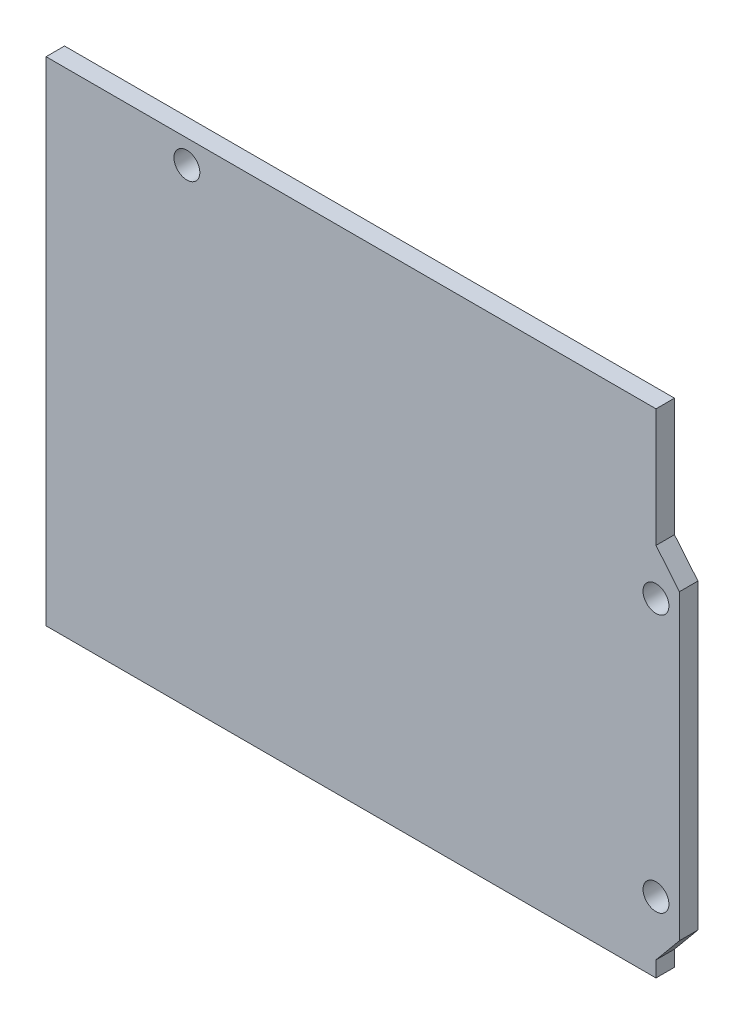
ISO-10303-21;
HEADER;
FILE_DESCRIPTION(('STEP AP214'),'2;1');
FILE_NAME('part.step','',(''),(''),'','','');
FILE_SCHEMA(('AUTOMOTIVE_DESIGN { 1 0 10303 214 1 1 1 1 }'));
ENDSEC;
DATA;
#1=APPLICATION_CONTEXT('core data for automotive mechanical design processes');
#2=APPLICATION_PROTOCOL_DEFINITION('international standard','automotive_design',2000,#1);
#3=PRODUCT_CONTEXT('',#1,'mechanical');
#4=PRODUCT('Part','Part','',(#3));
#5=PRODUCT_RELATED_PRODUCT_CATEGORY('part','',(#4));
#6=PRODUCT_DEFINITION_FORMATION('','',#4);
#7=PRODUCT_DEFINITION_CONTEXT('part definition',#1,'design');
#8=PRODUCT_DEFINITION('design','',#6,#7);
#9=PRODUCT_DEFINITION_SHAPE('','',#8);
#10=(LENGTH_UNIT() NAMED_UNIT(*) SI_UNIT(.MILLI.,.METRE.));
#11=(NAMED_UNIT(*) PLANE_ANGLE_UNIT() SI_UNIT($,.RADIAN.));
#12=(NAMED_UNIT(*) SI_UNIT($,.STERADIAN.) SOLID_ANGLE_UNIT());
#13=UNCERTAINTY_MEASURE_WITH_UNIT(LENGTH_MEASURE(1.E-05),#10,'distance_accuracy_value','');
#14=(GEOMETRIC_REPRESENTATION_CONTEXT(3) GLOBAL_UNCERTAINTY_ASSIGNED_CONTEXT((#13)) GLOBAL_UNIT_ASSIGNED_CONTEXT((#10,
#11,#12)) REPRESENTATION_CONTEXT('',''));
#15=CARTESIAN_POINT('',(0.,0.,0.));
#16=DIRECTION('',(0.,0.,1.));
#17=DIRECTION('',(1.,0.,0.));
#18=AXIS2_PLACEMENT_3D('',#15,#16,#17);
#19=CARTESIAN_POINT('',(0.,0.,-2.));
#20=DIRECTION('',(0.,-1.,0.));
#21=DIRECTION('',(0.,0.,-1.));
#22=AXIS2_PLACEMENT_3D('',#19,#20,#21);
#23=PLANE('',#22);
#24=DIRECTION('',(1.,0.,0.));
#25=VECTOR('',#24,1.);
#26=CARTESIAN_POINT('',(0.,0.,0.));
#27=LINE('',#26,#25);
#28=CARTESIAN_POINT('',(0.,0.,0.));
#29=VERTEX_POINT('',#28);
#30=CARTESIAN_POINT('',(66.0000000000001,0.,0.));
#31=VERTEX_POINT('',#30);
#32=EDGE_CURVE('E133',#29,#31,#27,.T.);
#33=ORIENTED_EDGE('',*,*,#32,.F.);
#34=DIRECTION('',(0.,0.,1.));
#35=VECTOR('',#34,1.);
#36=CARTESIAN_POINT('',(0.,0.,-2.));
#37=LINE('',#36,#35);
#38=CARTESIAN_POINT('',(0.,0.,-2.));
#39=VERTEX_POINT('',#38);
#40=EDGE_CURVE('E11',#39,#29,#37,.T.);
#41=ORIENTED_EDGE('',*,*,#40,.F.);
#42=DIRECTION('',(1.,0.,0.));
#43=VECTOR('',#42,1.);
#44=CARTESIAN_POINT('',(0.,0.,-2.));
#45=LINE('',#44,#43);
#46=CARTESIAN_POINT('',(66.0000000000001,0.,-2.));
#47=VERTEX_POINT('',#46);
#48=EDGE_CURVE('E154',#39,#47,#45,.T.);
#49=ORIENTED_EDGE('',*,*,#48,.T.);
#50=DIRECTION('',(0.,0.,1.));
#51=VECTOR('',#50,1.);
#52=CARTESIAN_POINT('',(66.0000000000001,0.,-2.));
#53=LINE('',#52,#51);
#54=EDGE_CURVE('E39',#47,#31,#53,.T.);
#55=ORIENTED_EDGE('',*,*,#54,.T.);
#56=EDGE_LOOP('',(#33,#41,#49,#55));
#57=FACE_BOUND('',#56,.T.);
#58=ADVANCED_FACE('F36',(#57),#23,.T.);
#59=CARTESIAN_POINT('',(0.,0.,-2.));
#60=DIRECTION('',(-1.,0.,0.));
#61=DIRECTION('',(0.,0.,1.));
#62=AXIS2_PLACEMENT_3D('',#59,#60,#61);
#63=PLANE('',#62);
#64=DIRECTION('',(0.,-1.,0.));
#65=VECTOR('',#64,1.);
#66=CARTESIAN_POINT('',(0.,0.,0.));
#67=LINE('',#66,#65);
#68=CARTESIAN_POINT('',(0.,53.34,0.));
#69=VERTEX_POINT('',#68);
#70=EDGE_CURVE('E152',#69,#29,#67,.T.);
#71=ORIENTED_EDGE('',*,*,#70,.F.);
#72=DIRECTION('',(0.,0.,1.));
#73=VECTOR('',#72,1.);
#74=CARTESIAN_POINT('',(0.,53.34,-2.));
#75=LINE('',#74,#73);
#76=CARTESIAN_POINT('',(0.,53.34,-2.));
#77=VERTEX_POINT('',#76);
#78=EDGE_CURVE('E45',#77,#69,#75,.T.);
#79=ORIENTED_EDGE('',*,*,#78,.F.);
#80=DIRECTION('',(0.,-1.,0.));
#81=VECTOR('',#80,1.);
#82=CARTESIAN_POINT('',(0.,0.,-2.));
#83=LINE('',#82,#81);
#84=EDGE_CURVE('E123',#77,#39,#83,.T.);
#85=ORIENTED_EDGE('',*,*,#84,.T.);
#86=ORIENTED_EDGE('',*,*,#40,.T.);
#87=EDGE_LOOP('',(#71,#79,#85,#86));
#88=FACE_BOUND('',#87,.T.);
#89=ADVANCED_FACE('F166',(#88),#63,.T.);
#90=CARTESIAN_POINT('',(0.,53.34,-2.));
#91=DIRECTION('',(0.,1.,0.));
#92=DIRECTION('',(0.,0.,1.));
#93=AXIS2_PLACEMENT_3D('',#90,#91,#92);
#94=PLANE('',#93);
#95=DIRECTION('',(-1.,0.,0.));
#96=VECTOR('',#95,1.);
#97=CARTESIAN_POINT('',(0.,53.34,0.));
#98=LINE('',#97,#96);
#99=CARTESIAN_POINT('',(66.,53.34,0.));
#100=VERTEX_POINT('',#99);
#101=EDGE_CURVE('E110',#100,#69,#98,.T.);
#102=ORIENTED_EDGE('',*,*,#101,.F.);
#103=DIRECTION('',(0.,0.,1.));
#104=VECTOR('',#103,1.);
#105=CARTESIAN_POINT('',(66.,53.34,-2.));
#106=LINE('',#105,#104);
#107=CARTESIAN_POINT('',(66.,53.34,-2.));
#108=VERTEX_POINT('',#107);
#109=EDGE_CURVE('E105',#108,#100,#106,.T.);
#110=ORIENTED_EDGE('',*,*,#109,.F.);
#111=DIRECTION('',(-1.,0.,0.));
#112=VECTOR('',#111,1.);
#113=CARTESIAN_POINT('',(0.,53.34,-2.));
#114=LINE('',#113,#112);
#115=EDGE_CURVE('E108',#108,#77,#114,.T.);
#116=ORIENTED_EDGE('',*,*,#115,.T.);
#117=ORIENTED_EDGE('',*,*,#78,.T.);
#118=EDGE_LOOP('',(#102,#110,#116,#117));
#119=FACE_BOUND('',#118,.T.);
#120=ADVANCED_FACE('F107',(#119),#94,.T.);
#121=CARTESIAN_POINT('',(66.,53.34,-2.));
#122=DIRECTION('',(1.,0.,0.));
#123=DIRECTION('',(0.,1.,0.));
#124=AXIS2_PLACEMENT_3D('',#121,#122,#123);
#125=PLANE('',#124);
#126=DIRECTION('',(0.,1.,0.));
#127=VECTOR('',#126,1.);
#128=CARTESIAN_POINT('',(66.,53.34,0.));
#129=LINE('',#128,#127);
#130=CARTESIAN_POINT('',(66.,40.54,0.));
#131=VERTEX_POINT('',#130);
#132=EDGE_CURVE('E149',#131,#100,#129,.T.);
#133=ORIENTED_EDGE('',*,*,#132,.F.);
#134=DIRECTION('',(0.,0.,1.));
#135=VECTOR('',#134,1.);
#136=CARTESIAN_POINT('',(66.,40.54,-2.));
#137=LINE('',#136,#135);
#138=CARTESIAN_POINT('',(66.,40.54,-2.));
#139=VERTEX_POINT('',#138);
#140=EDGE_CURVE('E115',#139,#131,#137,.T.);
#141=ORIENTED_EDGE('',*,*,#140,.F.);
#142=DIRECTION('',(0.,1.,0.));
#143=VECTOR('',#142,1.);
#144=CARTESIAN_POINT('',(66.,53.34,-2.));
#145=LINE('',#144,#143);
#146=EDGE_CURVE('E121',#139,#108,#145,.T.);
#147=ORIENTED_EDGE('',*,*,#146,.T.);
#148=ORIENTED_EDGE('',*,*,#109,.T.);
#149=EDGE_LOOP('',(#133,#141,#147,#148));
#150=FACE_BOUND('',#149,.T.);
#151=ADVANCED_FACE('F125',(#150),#125,.T.);
#152=CARTESIAN_POINT('',(66.,40.54,-2.));
#153=DIRECTION('',(0.770110743378981,0.637910215416145,0.));
#154=DIRECTION('',(-0.637910215416145,0.770110743378981,0.));
#155=AXIS2_PLACEMENT_3D('',#152,#153,#154);
#156=PLANE('',#155);
#157=DIRECTION('',(-0.637910215416145,0.770110743378981,0.));
#158=VECTOR('',#157,1.);
#159=CARTESIAN_POINT('',(66.,40.54,0.));
#160=LINE('',#159,#158);
#161=CARTESIAN_POINT('',(68.5400000000001,37.4736103405922,0.));
#162=VERTEX_POINT('',#161);
#163=EDGE_CURVE('E146',#162,#131,#160,.T.);
#164=ORIENTED_EDGE('',*,*,#163,.F.);
#165=DIRECTION('',(0.,0.,1.));
#166=VECTOR('',#165,1.);
#167=CARTESIAN_POINT('',(68.5400000000001,37.4736103405922,-2.));
#168=LINE('',#167,#166);
#169=CARTESIAN_POINT('',(68.5400000000001,37.4736103405922,-2.));
#170=VERTEX_POINT('',#169);
#171=EDGE_CURVE('E158',#170,#162,#168,.T.);
#172=ORIENTED_EDGE('',*,*,#171,.F.);
#173=DIRECTION('',(-0.637910215416145,0.770110743378981,0.));
#174=VECTOR('',#173,1.);
#175=CARTESIAN_POINT('',(66.,40.54,-2.));
#176=LINE('',#175,#174);
#177=EDGE_CURVE('E126',#170,#139,#176,.T.);
#178=ORIENTED_EDGE('',*,*,#177,.T.);
#179=ORIENTED_EDGE('',*,*,#140,.T.);
#180=EDGE_LOOP('',(#164,#172,#178,#179));
#181=FACE_BOUND('',#180,.T.);
#182=ADVANCED_FACE('F179',(#181),#156,.T.);
#183=CARTESIAN_POINT('',(68.5400000000001,4.76545397357685,-2.));
#184=DIRECTION('',(1.,0.,0.));
#185=DIRECTION('',(0.,0.,-1.));
#186=AXIS2_PLACEMENT_3D('',#183,#184,#185);
#187=PLANE('',#186);
#188=DIRECTION('',(0.,1.,0.));
#189=VECTOR('',#188,1.);
#190=CARTESIAN_POINT('',(68.5400000000001,4.76545397357685,0.));
#191=LINE('',#190,#189);
#192=CARTESIAN_POINT('',(68.5400000000001,4.76545397357685,0.));
#193=VERTEX_POINT('',#192);
#194=EDGE_CURVE('E143',#193,#162,#191,.T.);
#195=ORIENTED_EDGE('',*,*,#194,.F.);
#196=DIRECTION('',(0.,0.,1.));
#197=VECTOR('',#196,1.);
#198=CARTESIAN_POINT('',(68.5400000000001,4.76545397357685,-2.));
#199=LINE('',#198,#197);
#200=CARTESIAN_POINT('',(68.5400000000001,4.76545397357685,-2.));
#201=VERTEX_POINT('',#200);
#202=EDGE_CURVE('E160',#201,#193,#199,.T.);
#203=ORIENTED_EDGE('',*,*,#202,.F.);
#204=DIRECTION('',(0.,1.,0.));
#205=VECTOR('',#204,1.);
#206=CARTESIAN_POINT('',(68.5400000000001,4.76545397357685,-2.));
#207=LINE('',#206,#205);
#208=EDGE_CURVE('E128',#201,#170,#207,.T.);
#209=ORIENTED_EDGE('',*,*,#208,.T.);
#210=ORIENTED_EDGE('',*,*,#171,.T.);
#211=EDGE_LOOP('',(#195,#203,#209,#210));
#212=FACE_BOUND('',#211,.T.);
#213=ADVANCED_FACE('F182',(#212),#187,.T.);
#214=CARTESIAN_POINT('',(66.0000000000001,1.69906431416921,-2.));
#215=DIRECTION('',(0.770110743378978,-0.637910215416149,0.));
#216=DIRECTION('',(0.637910215416149,0.770110743378978,0.));
#217=AXIS2_PLACEMENT_3D('',#214,#215,#216);
#218=PLANE('',#217);
#219=DIRECTION('',(0.637910215416149,0.770110743378978,0.));
#220=VECTOR('',#219,1.);
#221=CARTESIAN_POINT('',(66.0000000000001,1.69906431416921,0.));
#222=LINE('',#221,#220);
#223=CARTESIAN_POINT('',(66.0000000000001,1.69906431416921,0.));
#224=VERTEX_POINT('',#223);
#225=EDGE_CURVE('E140',#224,#193,#222,.T.);
#226=ORIENTED_EDGE('',*,*,#225,.F.);
#227=DIRECTION('',(0.,0.,1.));
#228=VECTOR('',#227,1.);
#229=CARTESIAN_POINT('',(66.0000000000001,1.69906431416921,-2.));
#230=LINE('',#229,#228);
#231=CARTESIAN_POINT('',(66.0000000000001,1.69906431416921,-2.));
#232=VERTEX_POINT('',#231);
#233=EDGE_CURVE('E161',#232,#224,#230,.T.);
#234=ORIENTED_EDGE('',*,*,#233,.F.);
#235=DIRECTION('',(0.637910215416149,0.770110743378978,0.));
#236=VECTOR('',#235,1.);
#237=CARTESIAN_POINT('',(66.0000000000001,1.69906431416921,-2.));
#238=LINE('',#237,#236);
#239=EDGE_CURVE('E238',#232,#201,#238,.T.);
#240=ORIENTED_EDGE('',*,*,#239,.T.);
#241=ORIENTED_EDGE('',*,*,#202,.T.);
#242=EDGE_LOOP('',(#226,#234,#240,#241));
#243=FACE_BOUND('',#242,.T.);
#244=ADVANCED_FACE('F186',(#243),#218,.T.);
#245=CARTESIAN_POINT('',(66.0000000000001,0.,-2.));
#246=DIRECTION('',(1.,0.,0.));
#247=DIRECTION('',(0.,1.,0.));
#248=AXIS2_PLACEMENT_3D('',#245,#246,#247);
#249=PLANE('',#248);
#250=DIRECTION('',(0.,1.,0.));
#251=VECTOR('',#250,1.);
#252=CARTESIAN_POINT('',(66.0000000000001,0.,0.));
#253=LINE('',#252,#251);
#254=EDGE_CURVE('E136',#31,#224,#253,.T.);
#255=ORIENTED_EDGE('',*,*,#254,.F.);
#256=ORIENTED_EDGE('',*,*,#54,.F.);
#257=DIRECTION('',(0.,1.,0.));
#258=VECTOR('',#257,1.);
#259=CARTESIAN_POINT('',(66.0000000000001,0.,-2.));
#260=LINE('',#259,#258);
#261=EDGE_CURVE('E236',#47,#232,#260,.T.);
#262=ORIENTED_EDGE('',*,*,#261,.T.);
#263=ORIENTED_EDGE('',*,*,#233,.T.);
#264=EDGE_LOOP('',(#255,#256,#262,#263));
#265=FACE_BOUND('',#264,.T.);
#266=ADVANCED_FACE('F163',(#265),#249,.T.);
#267=CARTESIAN_POINT('',(0.,0.,-2.));
#268=DIRECTION('',(0.,0.,1.));
#269=DIRECTION('',(1.,0.,0.));
#270=AXIS2_PLACEMENT_3D('',#267,#268,#269);
#271=PLANE('',#270);
#272=CARTESIAN_POINT('',(66.0000000000001,7.62,-2.));
#273=DIRECTION('',(0.,0.,1.));
#274=DIRECTION('',(1.,0.,0.));
#275=AXIS2_PLACEMENT_3D('',#272,#273,#274);
#276=CIRCLE('',#275,1.4);
#277=CARTESIAN_POINT('',(67.4000000000001,7.62,-2.));
#278=VERTEX_POINT('',#277);
#279=EDGE_CURVE('E217',#278,#278,#276,.T.);
#280=ORIENTED_EDGE('',*,*,#279,.T.);
#281=EDGE_LOOP('',(#280));
#282=FACE_BOUND('',#281,.T.);
#283=CARTESIAN_POINT('',(66.0000000000001,35.56,-2.));
#284=DIRECTION('',(0.,0.,1.));
#285=DIRECTION('',(1.,0.,0.));
#286=AXIS2_PLACEMENT_3D('',#283,#284,#285);
#287=CIRCLE('',#286,1.4);
#288=CARTESIAN_POINT('',(67.4000000000001,35.56,-2.));
#289=VERTEX_POINT('',#288);
#290=EDGE_CURVE('E225',#289,#289,#287,.T.);
#291=ORIENTED_EDGE('',*,*,#290,.T.);
#292=EDGE_LOOP('',(#291));
#293=FACE_BOUND('',#292,.T.);
#294=CARTESIAN_POINT('',(15.24,50.8,-2.));
#295=DIRECTION('',(0.,0.,1.));
#296=DIRECTION('',(1.,0.,0.));
#297=AXIS2_PLACEMENT_3D('',#294,#295,#296);
#298=CIRCLE('',#297,1.4);
#299=CARTESIAN_POINT('',(16.64,50.8,-2.));
#300=VERTEX_POINT('',#299);
#301=EDGE_CURVE('E137',#300,#300,#298,.T.);
#302=ORIENTED_EDGE('',*,*,#301,.T.);
#303=EDGE_LOOP('',(#302));
#304=FACE_BOUND('',#303,.T.);
#305=ORIENTED_EDGE('',*,*,#48,.F.);
#306=ORIENTED_EDGE('',*,*,#84,.F.);
#307=ORIENTED_EDGE('',*,*,#115,.F.);
#308=ORIENTED_EDGE('',*,*,#146,.F.);
#309=ORIENTED_EDGE('',*,*,#177,.F.);
#310=ORIENTED_EDGE('',*,*,#208,.F.);
#311=ORIENTED_EDGE('',*,*,#239,.F.);
#312=ORIENTED_EDGE('',*,*,#261,.F.);
#313=EDGE_LOOP('',(#305,#306,#307,#308,#309,#310,#311,#312));
#314=FACE_BOUND('',#313,.T.);
#315=ADVANCED_FACE('F119',(#282,#293,#304,#314),#271,.F.);
#316=CARTESIAN_POINT('',(0.,0.,0.));
#317=DIRECTION('',(0.,0.,1.));
#318=DIRECTION('',(1.,0.,0.));
#319=AXIS2_PLACEMENT_3D('',#316,#317,#318);
#320=PLANE('',#319);
#321=CARTESIAN_POINT('',(66.0000000000001,7.62,0.));
#322=DIRECTION('',(0.,0.,1.));
#323=DIRECTION('',(1.,0.,0.));
#324=AXIS2_PLACEMENT_3D('',#321,#322,#323);
#325=CIRCLE('',#324,1.4);
#326=CARTESIAN_POINT('',(67.4000000000001,7.62,0.));
#327=VERTEX_POINT('',#326);
#328=EDGE_CURVE('E220',#327,#327,#325,.T.);
#329=ORIENTED_EDGE('',*,*,#328,.F.);
#330=EDGE_LOOP('',(#329));
#331=FACE_BOUND('',#330,.T.);
#332=CARTESIAN_POINT('',(66.0000000000001,35.56,0.));
#333=DIRECTION('',(0.,0.,1.));
#334=DIRECTION('',(1.,0.,0.));
#335=AXIS2_PLACEMENT_3D('',#332,#333,#334);
#336=CIRCLE('',#335,1.4);
#337=CARTESIAN_POINT('',(67.4000000000001,35.56,0.));
#338=VERTEX_POINT('',#337);
#339=EDGE_CURVE('E222',#338,#338,#336,.T.);
#340=ORIENTED_EDGE('',*,*,#339,.F.);
#341=EDGE_LOOP('',(#340));
#342=FACE_BOUND('',#341,.T.);
#343=CARTESIAN_POINT('',(15.24,50.8,0.));
#344=DIRECTION('',(0.,0.,1.));
#345=DIRECTION('',(1.,0.,0.));
#346=AXIS2_PLACEMENT_3D('',#343,#344,#345);
#347=CIRCLE('',#346,1.4);
#348=CARTESIAN_POINT('',(16.64,50.8,0.));
#349=VERTEX_POINT('',#348);
#350=EDGE_CURVE('E228',#349,#349,#347,.T.);
#351=ORIENTED_EDGE('',*,*,#350,.F.);
#352=EDGE_LOOP('',(#351));
#353=FACE_BOUND('',#352,.T.);
#354=ORIENTED_EDGE('',*,*,#32,.T.);
#355=ORIENTED_EDGE('',*,*,#254,.T.);
#356=ORIENTED_EDGE('',*,*,#225,.T.);
#357=ORIENTED_EDGE('',*,*,#194,.T.);
#358=ORIENTED_EDGE('',*,*,#163,.T.);
#359=ORIENTED_EDGE('',*,*,#132,.T.);
#360=ORIENTED_EDGE('',*,*,#101,.T.);
#361=ORIENTED_EDGE('',*,*,#70,.T.);
#362=EDGE_LOOP('',(#354,#355,#356,#357,#358,#359,#360,#361));
#363=FACE_BOUND('',#362,.T.);
#364=ADVANCED_FACE('F165',(#331,#342,#353,#363),#320,.T.);
#365=CARTESIAN_POINT('',(15.24,50.8,-2.));
#366=DIRECTION('',(0.,0.,1.));
#367=DIRECTION('',(1.,0.,0.));
#368=AXIS2_PLACEMENT_3D('',#365,#366,#367);
#369=CYLINDRICAL_SURFACE('',#368,1.4);
#370=ORIENTED_EDGE('',*,*,#301,.F.);
#371=EDGE_LOOP('',(#370));
#372=FACE_BOUND('',#371,.T.);
#373=ORIENTED_EDGE('',*,*,#350,.T.);
#374=EDGE_LOOP('',(#373));
#375=FACE_BOUND('',#374,.T.);
#376=ADVANCED_FACE('F198',(#372,#375),#369,.F.);
#377=CARTESIAN_POINT('',(66.0000000000001,35.56,-2.));
#378=DIRECTION('',(0.,0.,1.));
#379=DIRECTION('',(1.,0.,0.));
#380=AXIS2_PLACEMENT_3D('',#377,#378,#379);
#381=CYLINDRICAL_SURFACE('',#380,1.4);
#382=ORIENTED_EDGE('',*,*,#290,.F.);
#383=EDGE_LOOP('',(#382));
#384=FACE_BOUND('',#383,.T.);
#385=ORIENTED_EDGE('',*,*,#339,.T.);
#386=EDGE_LOOP('',(#385));
#387=FACE_BOUND('',#386,.T.);
#388=ADVANCED_FACE('F205',(#384,#387),#381,.F.);
#389=CARTESIAN_POINT('',(66.0000000000001,7.62,-2.));
#390=DIRECTION('',(0.,0.,1.));
#391=DIRECTION('',(1.,0.,0.));
#392=AXIS2_PLACEMENT_3D('',#389,#390,#391);
#393=CYLINDRICAL_SURFACE('',#392,1.4);
#394=ORIENTED_EDGE('',*,*,#279,.F.);
#395=EDGE_LOOP('',(#394));
#396=FACE_BOUND('',#395,.T.);
#397=ORIENTED_EDGE('',*,*,#328,.T.);
#398=EDGE_LOOP('',(#397));
#399=FACE_BOUND('',#398,.T.);
#400=ADVANCED_FACE('F209',(#396,#399),#393,.F.);
#401=CLOSED_SHELL('',(#58,#89,#120,#151,#182,#213,#244,#266,#315,#364,#376,#388,#400));
#402=MANIFOLD_SOLID_BREP('B2',#401);
#403=ADVANCED_BREP_SHAPE_REPRESENTATION('',(#18,#402),#14);
#404=SHAPE_DEFINITION_REPRESENTATION(#9,#403);
ENDSEC;
END-ISO-10303-21;
